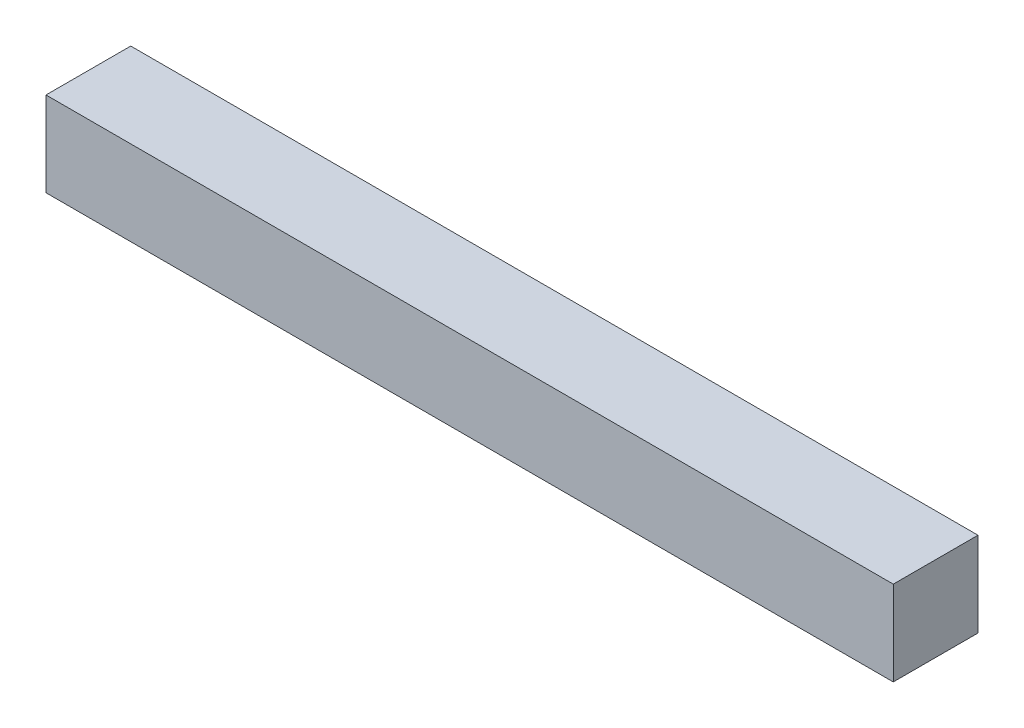
ISO-10303-21;
HEADER;
FILE_DESCRIPTION(('STEP AP214'),'2;1');
FILE_NAME('part.step','',(''),(''),'','','');
FILE_SCHEMA(('AUTOMOTIVE_DESIGN { 1 0 10303 214 1 1 1 1 }'));
ENDSEC;
DATA;
#1=APPLICATION_CONTEXT('core data for automotive mechanical design processes');
#2=APPLICATION_PROTOCOL_DEFINITION('international standard','automotive_design',2000,#1);
#3=PRODUCT_CONTEXT('',#1,'mechanical');
#4=PRODUCT('Part','Part','',(#3));
#5=PRODUCT_RELATED_PRODUCT_CATEGORY('part','',(#4));
#6=PRODUCT_DEFINITION_FORMATION('','',#4);
#7=PRODUCT_DEFINITION_CONTEXT('part definition',#1,'design');
#8=PRODUCT_DEFINITION('design','',#6,#7);
#9=PRODUCT_DEFINITION_SHAPE('','',#8);
#10=(LENGTH_UNIT() NAMED_UNIT(*) SI_UNIT(.MILLI.,.METRE.));
#11=(NAMED_UNIT(*) PLANE_ANGLE_UNIT() SI_UNIT($,.RADIAN.));
#12=(NAMED_UNIT(*) SI_UNIT($,.STERADIAN.) SOLID_ANGLE_UNIT());
#13=UNCERTAINTY_MEASURE_WITH_UNIT(LENGTH_MEASURE(1.E-05),#10,'distance_accuracy_value','');
#14=(GEOMETRIC_REPRESENTATION_CONTEXT(3) GLOBAL_UNCERTAINTY_ASSIGNED_CONTEXT((#13)) GLOBAL_UNIT_ASSIGNED_CONTEXT((#10,
#11,#12)) REPRESENTATION_CONTEXT('',''));
#15=CARTESIAN_POINT('',(0.,0.,0.));
#16=DIRECTION('',(0.,0.,1.));
#17=DIRECTION('',(1.,0.,0.));
#18=AXIS2_PLACEMENT_3D('',#15,#16,#17);
#19=CARTESIAN_POINT('',(300.,25.8064516129032,40.));
#20=DIRECTION('',(0.,0.,-1.));
#21=DIRECTION('',(0.,1.,0.));
#22=AXIS2_PLACEMENT_3D('',#19,#20,#21);
#23=PLANE('',#22);
#24=DIRECTION('',(0.,-1.,0.));
#25=VECTOR('',#24,1.);
#26=CARTESIAN_POINT('',(0.,25.8064516129032,40.));
#27=LINE('',#26,#25);
#28=CARTESIAN_POINT('',(0.,25.8064516129032,40.));
#29=VERTEX_POINT('',#28);
#30=CARTESIAN_POINT('',(0.,-4.19354838709675,40.));
#31=VERTEX_POINT('',#30);
#32=EDGE_CURVE('E107',#29,#31,#27,.T.);
#33=ORIENTED_EDGE('',*,*,#32,.T.);
#34=DIRECTION('',(-1.,0.,0.));
#35=VECTOR('',#34,1.);
#36=CARTESIAN_POINT('',(300.,-4.19354838709675,40.));
#37=LINE('',#36,#35);
#38=CARTESIAN_POINT('',(300.,-4.19354838709675,40.));
#39=VERTEX_POINT('',#38);
#40=EDGE_CURVE('E11',#39,#31,#37,.T.);
#41=ORIENTED_EDGE('',*,*,#40,.F.);
#42=DIRECTION('',(0.,-1.,0.));
#43=VECTOR('',#42,1.);
#44=CARTESIAN_POINT('',(300.,25.8064516129032,40.));
#45=LINE('',#44,#43);
#46=CARTESIAN_POINT('',(300.,25.8064516129032,40.));
#47=VERTEX_POINT('',#46);
#48=EDGE_CURVE('E91',#47,#39,#45,.T.);
#49=ORIENTED_EDGE('',*,*,#48,.F.);
#50=DIRECTION('',(-1.,0.,0.));
#51=VECTOR('',#50,1.);
#52=CARTESIAN_POINT('',(300.,25.8064516129032,40.));
#53=LINE('',#52,#51);
#54=EDGE_CURVE('E103',#47,#29,#53,.T.);
#55=ORIENTED_EDGE('',*,*,#54,.T.);
#56=EDGE_LOOP('',(#33,#41,#49,#55));
#57=FACE_BOUND('',#56,.T.);
#58=ADVANCED_FACE('F39',(#57),#23,.F.);
#59=CARTESIAN_POINT('',(300.,-4.19354838709675,40.));
#60=DIRECTION('',(0.,1.,0.));
#61=DIRECTION('',(0.,0.,1.));
#62=AXIS2_PLACEMENT_3D('',#59,#60,#61);
#63=PLANE('',#62);
#64=DIRECTION('',(0.,0.,-1.));
#65=VECTOR('',#64,1.);
#66=CARTESIAN_POINT('',(0.,-4.19354838709675,40.));
#67=LINE('',#66,#65);
#68=CARTESIAN_POINT('',(0.,-4.19354838709675,10.));
#69=VERTEX_POINT('',#68);
#70=EDGE_CURVE('E96',#31,#69,#67,.T.);
#71=ORIENTED_EDGE('',*,*,#70,.T.);
#72=DIRECTION('',(-1.,0.,0.));
#73=VECTOR('',#72,1.);
#74=CARTESIAN_POINT('',(300.,-4.19354838709675,10.));
#75=LINE('',#74,#73);
#76=CARTESIAN_POINT('',(300.,-4.19354838709675,10.));
#77=VERTEX_POINT('',#76);
#78=EDGE_CURVE('E48',#77,#69,#75,.T.);
#79=ORIENTED_EDGE('',*,*,#78,.F.);
#80=DIRECTION('',(0.,0.,-1.));
#81=VECTOR('',#80,1.);
#82=CARTESIAN_POINT('',(300.,-4.19354838709675,40.));
#83=LINE('',#82,#81);
#84=EDGE_CURVE('E86',#39,#77,#83,.T.);
#85=ORIENTED_EDGE('',*,*,#84,.F.);
#86=ORIENTED_EDGE('',*,*,#40,.T.);
#87=EDGE_LOOP('',(#71,#79,#85,#86));
#88=FACE_BOUND('',#87,.T.);
#89=ADVANCED_FACE('F95',(#88),#63,.F.);
#90=CARTESIAN_POINT('',(300.,25.8064516129032,10.0000000000001));
#91=DIRECTION('',(0.,0.,1.));
#92=DIRECTION('',(0.,-1.,0.));
#93=AXIS2_PLACEMENT_3D('',#90,#91,#92);
#94=PLANE('',#93);
#95=DIRECTION('',(0.,1.,0.));
#96=VECTOR('',#95,1.);
#97=CARTESIAN_POINT('',(0.,25.8064516129032,10.0000000000001));
#98=LINE('',#97,#96);
#99=CARTESIAN_POINT('',(0.,25.8064516129032,10.0000000000001));
#100=VERTEX_POINT('',#99);
#101=EDGE_CURVE('E73',#69,#100,#98,.T.);
#102=ORIENTED_EDGE('',*,*,#101,.T.);
#103=DIRECTION('',(-1.,0.,0.));
#104=VECTOR('',#103,1.);
#105=CARTESIAN_POINT('',(300.,25.8064516129032,10.0000000000001));
#106=LINE('',#105,#104);
#107=CARTESIAN_POINT('',(300.,25.8064516129032,10.0000000000001));
#108=VERTEX_POINT('',#107);
#109=EDGE_CURVE('E98',#108,#100,#106,.T.);
#110=ORIENTED_EDGE('',*,*,#109,.F.);
#111=DIRECTION('',(0.,1.,0.));
#112=VECTOR('',#111,1.);
#113=CARTESIAN_POINT('',(300.,25.8064516129032,10.0000000000001));
#114=LINE('',#113,#112);
#115=EDGE_CURVE('E89',#77,#108,#114,.T.);
#116=ORIENTED_EDGE('',*,*,#115,.F.);
#117=ORIENTED_EDGE('',*,*,#78,.T.);
#118=EDGE_LOOP('',(#102,#110,#116,#117));
#119=FACE_BOUND('',#118,.T.);
#120=ADVANCED_FACE('F99',(#119),#94,.F.);
#121=CARTESIAN_POINT('',(300.,25.8064516129032,40.));
#122=DIRECTION('',(0.,-1.,0.));
#123=DIRECTION('',(0.,0.,-1.));
#124=AXIS2_PLACEMENT_3D('',#121,#122,#123);
#125=PLANE('',#124);
#126=DIRECTION('',(0.,0.,1.));
#127=VECTOR('',#126,1.);
#128=CARTESIAN_POINT('',(0.,25.8064516129032,40.));
#129=LINE('',#128,#127);
#130=EDGE_CURVE('E79',#100,#29,#129,.T.);
#131=ORIENTED_EDGE('',*,*,#130,.T.);
#132=ORIENTED_EDGE('',*,*,#54,.F.);
#133=DIRECTION('',(0.,0.,1.));
#134=VECTOR('',#133,1.);
#135=CARTESIAN_POINT('',(300.,25.8064516129032,40.));
#136=LINE('',#135,#134);
#137=EDGE_CURVE('E56',#108,#47,#136,.T.);
#138=ORIENTED_EDGE('',*,*,#137,.F.);
#139=ORIENTED_EDGE('',*,*,#109,.T.);
#140=EDGE_LOOP('',(#131,#132,#138,#139));
#141=FACE_BOUND('',#140,.T.);
#142=ADVANCED_FACE('F120',(#141),#125,.F.);
#143=CARTESIAN_POINT('',(300.,0.,0.));
#144=DIRECTION('',(1.,0.,0.));
#145=DIRECTION('',(0.,0.,-1.));
#146=AXIS2_PLACEMENT_3D('',#143,#144,#145);
#147=PLANE('',#146);
#148=ORIENTED_EDGE('',*,*,#48,.T.);
#149=ORIENTED_EDGE('',*,*,#84,.T.);
#150=ORIENTED_EDGE('',*,*,#115,.T.);
#151=ORIENTED_EDGE('',*,*,#137,.T.);
#152=EDGE_LOOP('',(#148,#149,#150,#151));
#153=FACE_BOUND('',#152,.T.);
#154=ADVANCED_FACE('F87',(#153),#147,.T.);
#155=CARTESIAN_POINT('',(0.,0.,0.));
#156=DIRECTION('',(1.,0.,0.));
#157=DIRECTION('',(0.,0.,-1.));
#158=AXIS2_PLACEMENT_3D('',#155,#156,#157);
#159=PLANE('',#158);
#160=ORIENTED_EDGE('',*,*,#32,.F.);
#161=ORIENTED_EDGE('',*,*,#130,.F.);
#162=ORIENTED_EDGE('',*,*,#101,.F.);
#163=ORIENTED_EDGE('',*,*,#70,.F.);
#164=EDGE_LOOP('',(#160,#161,#162,#163));
#165=FACE_BOUND('',#164,.T.);
#166=ADVANCED_FACE('F123',(#165),#159,.F.);
#167=CLOSED_SHELL('',(#58,#89,#120,#142,#154,#166));
#168=MANIFOLD_SOLID_BREP('B2',#167);
#169=ADVANCED_BREP_SHAPE_REPRESENTATION('',(#18,#168),#14);
#170=SHAPE_DEFINITION_REPRESENTATION(#9,#169);
ENDSEC;
END-ISO-10303-21;
